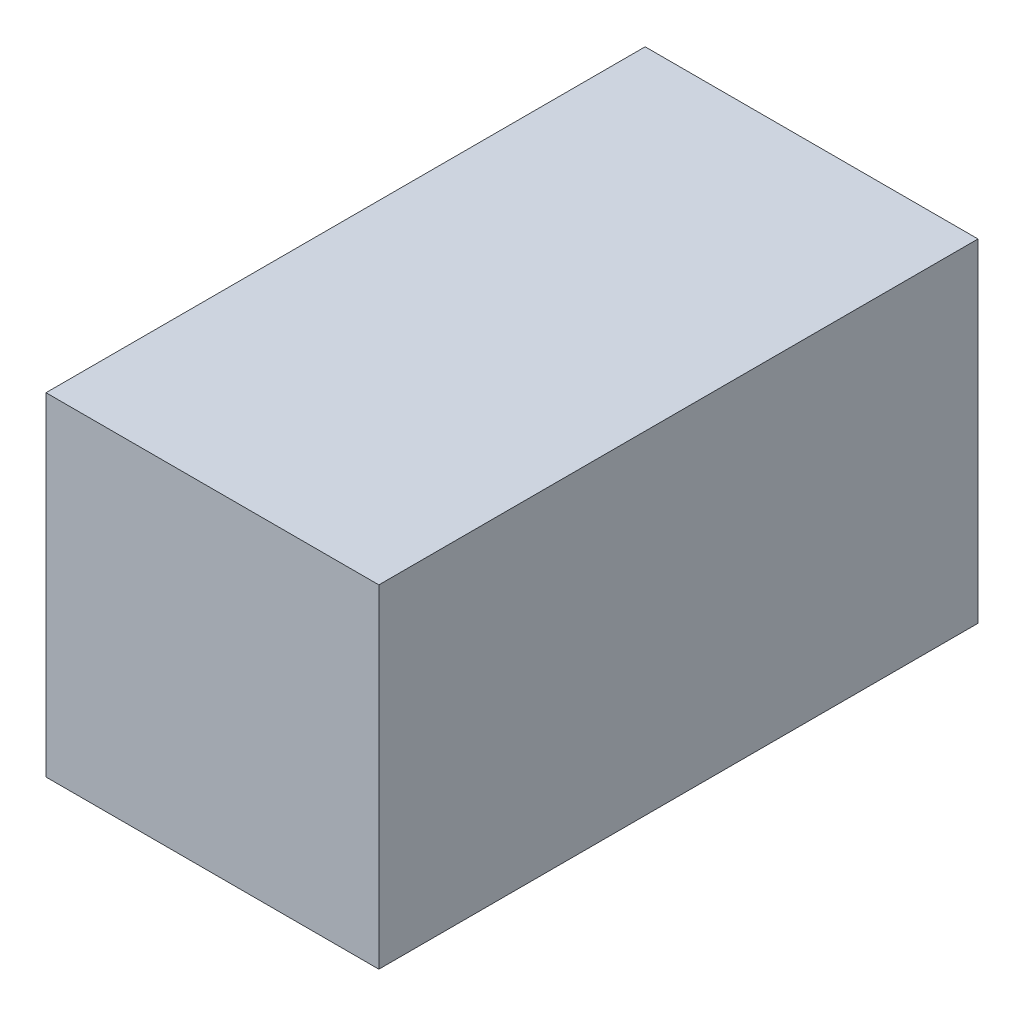
ISO-10303-21;
HEADER;
FILE_DESCRIPTION(('STEP AP214'),'2;1');
FILE_NAME('part.step','',(''),(''),'','','');
FILE_SCHEMA(('AUTOMOTIVE_DESIGN { 1 0 10303 214 1 1 1 1 }'));
ENDSEC;
DATA;
#1=APPLICATION_CONTEXT('core data for automotive mechanical design processes');
#2=APPLICATION_PROTOCOL_DEFINITION('international standard','automotive_design',2000,#1);
#3=PRODUCT_CONTEXT('',#1,'mechanical');
#4=PRODUCT('Part','Part','',(#3));
#5=PRODUCT_RELATED_PRODUCT_CATEGORY('part','',(#4));
#6=PRODUCT_DEFINITION_FORMATION('','',#4);
#7=PRODUCT_DEFINITION_CONTEXT('part definition',#1,'design');
#8=PRODUCT_DEFINITION('design','',#6,#7);
#9=PRODUCT_DEFINITION_SHAPE('','',#8);
#10=(LENGTH_UNIT() NAMED_UNIT(*) SI_UNIT(.MILLI.,.METRE.));
#11=(NAMED_UNIT(*) PLANE_ANGLE_UNIT() SI_UNIT($,.RADIAN.));
#12=(NAMED_UNIT(*) SI_UNIT($,.STERADIAN.) SOLID_ANGLE_UNIT());
#13=UNCERTAINTY_MEASURE_WITH_UNIT(LENGTH_MEASURE(1.E-05),#10,'distance_accuracy_value','');
#14=(GEOMETRIC_REPRESENTATION_CONTEXT(3) GLOBAL_UNCERTAINTY_ASSIGNED_CONTEXT((#13)) GLOBAL_UNIT_ASSIGNED_CONTEXT((#10,
#11,#12)) REPRESENTATION_CONTEXT('',''));
#15=CARTESIAN_POINT('',(0.,0.,0.));
#16=DIRECTION('',(0.,0.,1.));
#17=DIRECTION('',(1.,0.,0.));
#18=AXIS2_PLACEMENT_3D('',#15,#16,#17);
#19=CARTESIAN_POINT('',(200.,-200.,720.));
#20=DIRECTION('',(1.,0.,0.));
#21=DIRECTION('',(0.,0.,-1.));
#22=AXIS2_PLACEMENT_3D('',#19,#20,#21);
#23=PLANE('',#22);
#24=DIRECTION('',(0.,-1.,0.));
#25=VECTOR('',#24,1.);
#26=CARTESIAN_POINT('',(200.,-200.,0.));
#27=LINE('',#26,#25);
#28=CARTESIAN_POINT('',(200.,200.,0.));
#29=VERTEX_POINT('',#28);
#30=CARTESIAN_POINT('',(200.,-200.,0.));
#31=VERTEX_POINT('',#30);
#32=EDGE_CURVE('E97',#29,#31,#27,.T.);
#33=ORIENTED_EDGE('',*,*,#32,.F.);
#34=DIRECTION('',(0.,0.,-1.));
#35=VECTOR('',#34,1.);
#36=CARTESIAN_POINT('',(200.,200.,720.));
#37=LINE('',#36,#35);
#38=CARTESIAN_POINT('',(200.,200.,720.));
#39=VERTEX_POINT('',#38);
#40=EDGE_CURVE('E11',#39,#29,#37,.T.);
#41=ORIENTED_EDGE('',*,*,#40,.F.);
#42=DIRECTION('',(0.,-1.,0.));
#43=VECTOR('',#42,1.);
#44=CARTESIAN_POINT('',(200.,-200.,720.));
#45=LINE('',#44,#43);
#46=CARTESIAN_POINT('',(200.,-200.,720.));
#47=VERTEX_POINT('',#46);
#48=EDGE_CURVE('E91',#39,#47,#45,.T.);
#49=ORIENTED_EDGE('',*,*,#48,.T.);
#50=DIRECTION('',(0.,0.,-1.));
#51=VECTOR('',#50,1.);
#52=CARTESIAN_POINT('',(200.,-200.,720.));
#53=LINE('',#52,#51);
#54=EDGE_CURVE('E36',#47,#31,#53,.T.);
#55=ORIENTED_EDGE('',*,*,#54,.T.);
#56=EDGE_LOOP('',(#33,#41,#49,#55));
#57=FACE_BOUND('',#56,.T.);
#58=ADVANCED_FACE('F33',(#57),#23,.T.);
#59=CARTESIAN_POINT('',(-200.,200.,720.));
#60=DIRECTION('',(0.,1.,0.));
#61=DIRECTION('',(-1.,0.,0.));
#62=AXIS2_PLACEMENT_3D('',#59,#60,#61);
#63=PLANE('',#62);
#64=DIRECTION('',(1.,0.,0.));
#65=VECTOR('',#64,1.);
#66=CARTESIAN_POINT('',(-200.,200.,0.));
#67=LINE('',#66,#65);
#68=CARTESIAN_POINT('',(-200.,200.,0.));
#69=VERTEX_POINT('',#68);
#70=EDGE_CURVE('E93',#69,#29,#67,.T.);
#71=ORIENTED_EDGE('',*,*,#70,.F.);
#72=DIRECTION('',(0.,0.,-1.));
#73=VECTOR('',#72,1.);
#74=CARTESIAN_POINT('',(-200.,200.,720.));
#75=LINE('',#74,#73);
#76=CARTESIAN_POINT('',(-200.,200.,720.));
#77=VERTEX_POINT('',#76);
#78=EDGE_CURVE('E42',#77,#69,#75,.T.);
#79=ORIENTED_EDGE('',*,*,#78,.F.);
#80=DIRECTION('',(1.,0.,0.));
#81=VECTOR('',#80,1.);
#82=CARTESIAN_POINT('',(-200.,200.,720.));
#83=LINE('',#82,#81);
#84=EDGE_CURVE('E88',#77,#39,#83,.T.);
#85=ORIENTED_EDGE('',*,*,#84,.T.);
#86=ORIENTED_EDGE('',*,*,#40,.T.);
#87=EDGE_LOOP('',(#71,#79,#85,#86));
#88=FACE_BOUND('',#87,.T.);
#89=ADVANCED_FACE('F107',(#88),#63,.T.);
#90=CARTESIAN_POINT('',(-200.,-200.,720.));
#91=DIRECTION('',(-1.,0.,0.));
#92=DIRECTION('',(0.,0.,1.));
#93=AXIS2_PLACEMENT_3D('',#90,#91,#92);
#94=PLANE('',#93);
#95=DIRECTION('',(0.,1.,0.));
#96=VECTOR('',#95,1.);
#97=CARTESIAN_POINT('',(-200.,-200.,0.));
#98=LINE('',#97,#96);
#99=CARTESIAN_POINT('',(-200.,-200.,0.));
#100=VERTEX_POINT('',#99);
#101=EDGE_CURVE('E83',#100,#69,#98,.T.);
#102=ORIENTED_EDGE('',*,*,#101,.F.);
#103=DIRECTION('',(0.,0.,-1.));
#104=VECTOR('',#103,1.);
#105=CARTESIAN_POINT('',(-200.,-200.,720.));
#106=LINE('',#105,#104);
#107=CARTESIAN_POINT('',(-200.,-200.,720.));
#108=VERTEX_POINT('',#107);
#109=EDGE_CURVE('E78',#108,#100,#106,.T.);
#110=ORIENTED_EDGE('',*,*,#109,.F.);
#111=DIRECTION('',(0.,1.,0.));
#112=VECTOR('',#111,1.);
#113=CARTESIAN_POINT('',(-200.,-200.,720.));
#114=LINE('',#113,#112);
#115=EDGE_CURVE('E81',#108,#77,#114,.T.);
#116=ORIENTED_EDGE('',*,*,#115,.T.);
#117=ORIENTED_EDGE('',*,*,#78,.T.);
#118=EDGE_LOOP('',(#102,#110,#116,#117));
#119=FACE_BOUND('',#118,.T.);
#120=ADVANCED_FACE('F80',(#119),#94,.T.);
#121=CARTESIAN_POINT('',(-200.,-200.,720.));
#122=DIRECTION('',(0.,-1.,0.));
#123=DIRECTION('',(0.,0.,-1.));
#124=AXIS2_PLACEMENT_3D('',#121,#122,#123);
#125=PLANE('',#124);
#126=DIRECTION('',(-1.,0.,0.));
#127=VECTOR('',#126,1.);
#128=CARTESIAN_POINT('',(-200.,-200.,0.));
#129=LINE('',#128,#127);
#130=EDGE_CURVE('E100',#31,#100,#129,.T.);
#131=ORIENTED_EDGE('',*,*,#130,.F.);
#132=ORIENTED_EDGE('',*,*,#54,.F.);
#133=DIRECTION('',(-1.,0.,0.));
#134=VECTOR('',#133,1.);
#135=CARTESIAN_POINT('',(-200.,-200.,720.));
#136=LINE('',#135,#134);
#137=EDGE_CURVE('E87',#47,#108,#136,.T.);
#138=ORIENTED_EDGE('',*,*,#137,.T.);
#139=ORIENTED_EDGE('',*,*,#109,.T.);
#140=EDGE_LOOP('',(#131,#132,#138,#139));
#141=FACE_BOUND('',#140,.T.);
#142=ADVANCED_FACE('F90',(#141),#125,.T.);
#143=CARTESIAN_POINT('',(0.,0.,720.));
#144=DIRECTION('',(0.,0.,-1.));
#145=DIRECTION('',(-1.,0.,0.));
#146=AXIS2_PLACEMENT_3D('',#143,#144,#145);
#147=PLANE('',#146);
#148=ORIENTED_EDGE('',*,*,#48,.F.);
#149=ORIENTED_EDGE('',*,*,#84,.F.);
#150=ORIENTED_EDGE('',*,*,#115,.F.);
#151=ORIENTED_EDGE('',*,*,#137,.F.);
#152=EDGE_LOOP('',(#148,#149,#150,#151));
#153=FACE_BOUND('',#152,.T.);
#154=ADVANCED_FACE('F86',(#153),#147,.F.);
#155=CARTESIAN_POINT('',(0.,0.,0.));
#156=DIRECTION('',(0.,0.,-1.));
#157=DIRECTION('',(-1.,0.,0.));
#158=AXIS2_PLACEMENT_3D('',#155,#156,#157);
#159=PLANE('',#158);
#160=ORIENTED_EDGE('',*,*,#32,.T.);
#161=ORIENTED_EDGE('',*,*,#130,.T.);
#162=ORIENTED_EDGE('',*,*,#101,.T.);
#163=ORIENTED_EDGE('',*,*,#70,.T.);
#164=EDGE_LOOP('',(#160,#161,#162,#163));
#165=FACE_BOUND('',#164,.T.);
#166=ADVANCED_FACE('F106',(#165),#159,.T.);
#167=CLOSED_SHELL('',(#58,#89,#120,#142,#154,#166));
#168=MANIFOLD_SOLID_BREP('B2',#167);
#169=ADVANCED_BREP_SHAPE_REPRESENTATION('',(#18,#168),#14);
#170=SHAPE_DEFINITION_REPRESENTATION(#9,#169);
ENDSEC;
END-ISO-10303-21;
